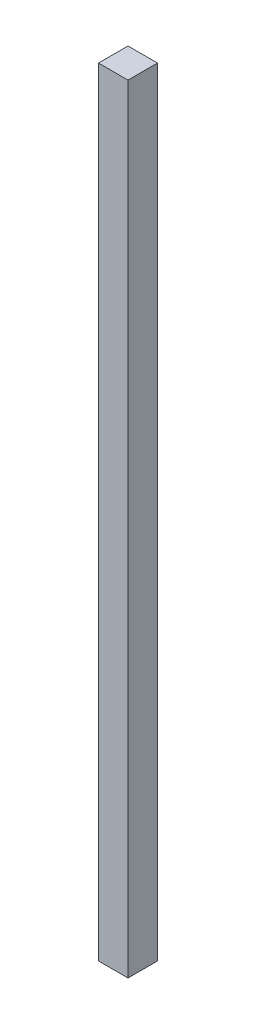
ISO-10303-21;
HEADER;
FILE_DESCRIPTION(('STEP AP214'),'2;1');
FILE_NAME('part.step','',(''),(''),'','','');
FILE_SCHEMA(('AUTOMOTIVE_DESIGN { 1 0 10303 214 1 1 1 1 }'));
ENDSEC;
DATA;
#1=APPLICATION_CONTEXT('core data for automotive mechanical design processes');
#2=APPLICATION_PROTOCOL_DEFINITION('international standard','automotive_design',2000,#1);
#3=PRODUCT_CONTEXT('',#1,'mechanical');
#4=PRODUCT('Part','Part','',(#3));
#5=PRODUCT_RELATED_PRODUCT_CATEGORY('part','',(#4));
#6=PRODUCT_DEFINITION_FORMATION('','',#4);
#7=PRODUCT_DEFINITION_CONTEXT('part definition',#1,'design');
#8=PRODUCT_DEFINITION('design','',#6,#7);
#9=PRODUCT_DEFINITION_SHAPE('','',#8);
#10=(LENGTH_UNIT() NAMED_UNIT(*) SI_UNIT(.MILLI.,.METRE.));
#11=(NAMED_UNIT(*) PLANE_ANGLE_UNIT() SI_UNIT($,.RADIAN.));
#12=(NAMED_UNIT(*) SI_UNIT($,.STERADIAN.) SOLID_ANGLE_UNIT());
#13=UNCERTAINTY_MEASURE_WITH_UNIT(LENGTH_MEASURE(1.E-05),#10,'distance_accuracy_value','');
#14=(GEOMETRIC_REPRESENTATION_CONTEXT(3) GLOBAL_UNCERTAINTY_ASSIGNED_CONTEXT((#13)) GLOBAL_UNIT_ASSIGNED_CONTEXT((#10,
#11,#12)) REPRESENTATION_CONTEXT('',''));
#15=CARTESIAN_POINT('',(0.,0.,0.));
#16=DIRECTION('',(0.,0.,1.));
#17=DIRECTION('',(1.,0.,0.));
#18=AXIS2_PLACEMENT_3D('',#15,#16,#17);
#19=CARTESIAN_POINT('',(9.4868329805,500.,-9.48683298));
#20=DIRECTION('',(-1.,0.,0.));
#21=DIRECTION('',(0.,0.,1.));
#22=AXIS2_PLACEMENT_3D('',#19,#20,#21);
#23=PLANE('',#22);
#24=DIRECTION('',(0.,0.,-1.));
#25=VECTOR('',#24,1.);
#26=CARTESIAN_POINT('',(9.4868329805,0.,-9.48683298));
#27=LINE('',#26,#25);
#28=CARTESIAN_POINT('',(9.4868329805,0.,9.48683298));
#29=VERTEX_POINT('',#28);
#30=CARTESIAN_POINT('',(9.4868329805,0.,-9.48683298));
#31=VERTEX_POINT('',#30);
#32=EDGE_CURVE('E113',#29,#31,#27,.T.);
#33=ORIENTED_EDGE('',*,*,#32,.T.);
#34=DIRECTION('',(0.,-1.,0.));
#35=VECTOR('',#34,1.);
#36=CARTESIAN_POINT('',(9.4868329805,500.,-9.48683298));
#37=LINE('',#36,#35);
#38=CARTESIAN_POINT('',(9.4868329805,500.,-9.48683298));
#39=VERTEX_POINT('',#38);
#40=EDGE_CURVE('E11',#39,#31,#37,.T.);
#41=ORIENTED_EDGE('',*,*,#40,.F.);
#42=DIRECTION('',(0.,0.,-1.));
#43=VECTOR('',#42,1.);
#44=CARTESIAN_POINT('',(9.4868329805,500.,-9.48683298));
#45=LINE('',#44,#43);
#46=CARTESIAN_POINT('',(9.4868329805,500.,9.48683298));
#47=VERTEX_POINT('',#46);
#48=EDGE_CURVE('E97',#47,#39,#45,.T.);
#49=ORIENTED_EDGE('',*,*,#48,.F.);
#50=DIRECTION('',(0.,-1.,0.));
#51=VECTOR('',#50,1.);
#52=CARTESIAN_POINT('',(9.4868329805,500.,9.48683298));
#53=LINE('',#52,#51);
#54=EDGE_CURVE('E109',#47,#29,#53,.T.);
#55=ORIENTED_EDGE('',*,*,#54,.T.);
#56=EDGE_LOOP('',(#33,#41,#49,#55));
#57=FACE_BOUND('',#56,.T.);
#58=ADVANCED_FACE('F45',(#57),#23,.F.);
#59=CARTESIAN_POINT('',(-9.4868329805,500.,-9.48683298));
#60=DIRECTION('',(0.,0.,1.));
#61=DIRECTION('',(1.,0.,0.));
#62=AXIS2_PLACEMENT_3D('',#59,#60,#61);
#63=PLANE('',#62);
#64=DIRECTION('',(-1.,0.,0.));
#65=VECTOR('',#64,1.);
#66=CARTESIAN_POINT('',(-9.4868329805,0.,-9.48683298));
#67=LINE('',#66,#65);
#68=CARTESIAN_POINT('',(-9.4868329805,0.,-9.48683298));
#69=VERTEX_POINT('',#68);
#70=EDGE_CURVE('E102',#31,#69,#67,.T.);
#71=ORIENTED_EDGE('',*,*,#70,.T.);
#72=DIRECTION('',(0.,-1.,0.));
#73=VECTOR('',#72,1.);
#74=CARTESIAN_POINT('',(-9.4868329805,500.,-9.48683298));
#75=LINE('',#74,#73);
#76=CARTESIAN_POINT('',(-9.4868329805,500.,-9.48683298));
#77=VERTEX_POINT('',#76);
#78=EDGE_CURVE('E54',#77,#69,#75,.T.);
#79=ORIENTED_EDGE('',*,*,#78,.F.);
#80=DIRECTION('',(-1.,0.,0.));
#81=VECTOR('',#80,1.);
#82=CARTESIAN_POINT('',(-9.4868329805,500.,-9.48683298));
#83=LINE('',#82,#81);
#84=EDGE_CURVE('E92',#39,#77,#83,.T.);
#85=ORIENTED_EDGE('',*,*,#84,.F.);
#86=ORIENTED_EDGE('',*,*,#40,.T.);
#87=EDGE_LOOP('',(#71,#79,#85,#86));
#88=FACE_BOUND('',#87,.T.);
#89=ADVANCED_FACE('F101',(#88),#63,.F.);
#90=CARTESIAN_POINT('',(-9.4868329805,500.,-9.48683298));
#91=DIRECTION('',(1.,0.,0.));
#92=DIRECTION('',(0.,0.,-1.));
#93=AXIS2_PLACEMENT_3D('',#90,#91,#92);
#94=PLANE('',#93);
#95=DIRECTION('',(0.,0.,1.));
#96=VECTOR('',#95,1.);
#97=CARTESIAN_POINT('',(-9.4868329805,0.,-9.48683298));
#98=LINE('',#97,#96);
#99=CARTESIAN_POINT('',(-9.4868329805,0.,9.48683298));
#100=VERTEX_POINT('',#99);
#101=EDGE_CURVE('E79',#69,#100,#98,.T.);
#102=ORIENTED_EDGE('',*,*,#101,.T.);
#103=DIRECTION('',(0.,-1.,0.));
#104=VECTOR('',#103,1.);
#105=CARTESIAN_POINT('',(-9.4868329805,500.,9.48683298));
#106=LINE('',#105,#104);
#107=CARTESIAN_POINT('',(-9.4868329805,500.,9.48683298));
#108=VERTEX_POINT('',#107);
#109=EDGE_CURVE('E104',#108,#100,#106,.T.);
#110=ORIENTED_EDGE('',*,*,#109,.F.);
#111=DIRECTION('',(0.,0.,1.));
#112=VECTOR('',#111,1.);
#113=CARTESIAN_POINT('',(-9.4868329805,500.,-9.48683298));
#114=LINE('',#113,#112);
#115=EDGE_CURVE('E95',#77,#108,#114,.T.);
#116=ORIENTED_EDGE('',*,*,#115,.F.);
#117=ORIENTED_EDGE('',*,*,#78,.T.);
#118=EDGE_LOOP('',(#102,#110,#116,#117));
#119=FACE_BOUND('',#118,.T.);
#120=ADVANCED_FACE('F105',(#119),#94,.F.);
#121=CARTESIAN_POINT('',(-9.4868329805,500.,9.48683298));
#122=DIRECTION('',(0.,0.,-1.));
#123=DIRECTION('',(-1.,0.,0.));
#124=AXIS2_PLACEMENT_3D('',#121,#122,#123);
#125=PLANE('',#124);
#126=DIRECTION('',(1.,0.,0.));
#127=VECTOR('',#126,1.);
#128=CARTESIAN_POINT('',(-9.4868329805,0.,9.48683298));
#129=LINE('',#128,#127);
#130=EDGE_CURVE('E85',#100,#29,#129,.T.);
#131=ORIENTED_EDGE('',*,*,#130,.T.);
#132=ORIENTED_EDGE('',*,*,#54,.F.);
#133=DIRECTION('',(1.,0.,0.));
#134=VECTOR('',#133,1.);
#135=CARTESIAN_POINT('',(-9.4868329805,500.,9.48683298));
#136=LINE('',#135,#134);
#137=EDGE_CURVE('E62',#108,#47,#136,.T.);
#138=ORIENTED_EDGE('',*,*,#137,.F.);
#139=ORIENTED_EDGE('',*,*,#109,.T.);
#140=EDGE_LOOP('',(#131,#132,#138,#139));
#141=FACE_BOUND('',#140,.T.);
#142=ADVANCED_FACE('F126',(#141),#125,.F.);
#143=CARTESIAN_POINT('',(0.,500.,0.));
#144=DIRECTION('',(0.,1.,0.));
#145=DIRECTION('',(0.,0.,1.));
#146=AXIS2_PLACEMENT_3D('',#143,#144,#145);
#147=PLANE('',#146);
#148=ORIENTED_EDGE('',*,*,#48,.T.);
#149=ORIENTED_EDGE('',*,*,#84,.T.);
#150=ORIENTED_EDGE('',*,*,#115,.T.);
#151=ORIENTED_EDGE('',*,*,#137,.T.);
#152=EDGE_LOOP('',(#148,#149,#150,#151));
#153=FACE_BOUND('',#152,.T.);
#154=ADVANCED_FACE('F93',(#153),#147,.T.);
#155=CARTESIAN_POINT('',(0.,0.,0.));
#156=DIRECTION('',(0.,1.,0.));
#157=DIRECTION('',(0.,0.,1.));
#158=AXIS2_PLACEMENT_3D('',#155,#156,#157);
#159=PLANE('',#158);
#160=ORIENTED_EDGE('',*,*,#32,.F.);
#161=ORIENTED_EDGE('',*,*,#130,.F.);
#162=ORIENTED_EDGE('',*,*,#101,.F.);
#163=ORIENTED_EDGE('',*,*,#70,.F.);
#164=EDGE_LOOP('',(#160,#161,#162,#163));
#165=FACE_BOUND('',#164,.T.);
#166=ADVANCED_FACE('F129',(#165),#159,.F.);
#167=CLOSED_SHELL('',(#58,#89,#120,#142,#154,#166));
#168=MANIFOLD_SOLID_BREP('B2',#167);
#169=ADVANCED_BREP_SHAPE_REPRESENTATION('',(#18,#168),#14);
#170=SHAPE_DEFINITION_REPRESENTATION(#9,#169);
ENDSEC;
END-ISO-10303-21;
